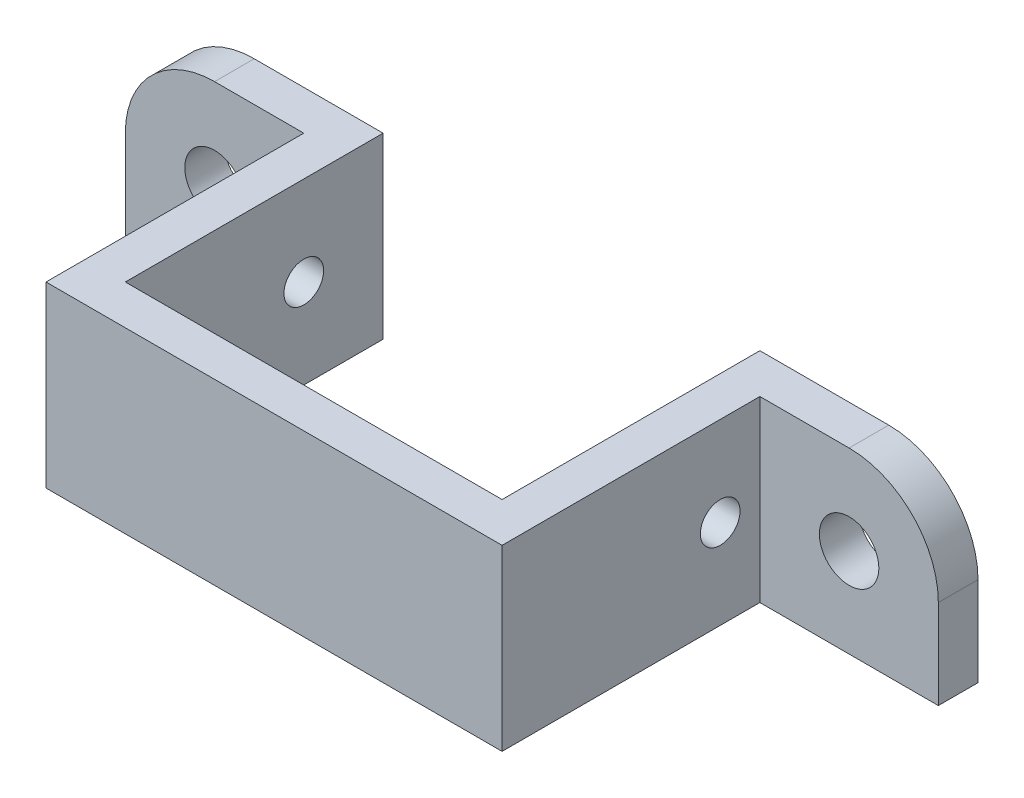
ISO-10303-21;
HEADER;
FILE_DESCRIPTION(('STEP AP214'),'2;1');
FILE_NAME('part.step','',(''),(''),'','','');
FILE_SCHEMA(('AUTOMOTIVE_DESIGN { 1 0 10303 214 1 1 1 1 }'));
ENDSEC;
DATA;
#1=APPLICATION_CONTEXT('core data for automotive mechanical design processes');
#2=APPLICATION_PROTOCOL_DEFINITION('international standard','automotive_design',2000,#1);
#3=PRODUCT_CONTEXT('',#1,'mechanical');
#4=PRODUCT('Part','Part','',(#3));
#5=PRODUCT_RELATED_PRODUCT_CATEGORY('part','',(#4));
#6=PRODUCT_DEFINITION_FORMATION('','',#4);
#7=PRODUCT_DEFINITION_CONTEXT('part definition',#1,'design');
#8=PRODUCT_DEFINITION('design','',#6,#7);
#9=PRODUCT_DEFINITION_SHAPE('','',#8);
#10=(LENGTH_UNIT() NAMED_UNIT(*) SI_UNIT(.MILLI.,.METRE.));
#11=(NAMED_UNIT(*) PLANE_ANGLE_UNIT() SI_UNIT($,.RADIAN.));
#12=(NAMED_UNIT(*) SI_UNIT($,.STERADIAN.) SOLID_ANGLE_UNIT());
#13=UNCERTAINTY_MEASURE_WITH_UNIT(LENGTH_MEASURE(1.E-05),#10,'distance_accuracy_value','');
#14=(GEOMETRIC_REPRESENTATION_CONTEXT(3) GLOBAL_UNCERTAINTY_ASSIGNED_CONTEXT((#13)) GLOBAL_UNIT_ASSIGNED_CONTEXT((#10,
#11,#12)) REPRESENTATION_CONTEXT('',''));
#15=CARTESIAN_POINT('',(0.,0.,0.));
#16=DIRECTION('',(0.,0.,1.));
#17=DIRECTION('',(1.,0.,0.));
#18=AXIS2_PLACEMENT_3D('',#15,#16,#17);
#19=CARTESIAN_POINT('',(-20.5,9.,-11.));
#20=DIRECTION('',(1.,0.,0.));
#21=DIRECTION('',(0.,0.,-1.));
#22=AXIS2_PLACEMENT_3D('',#19,#20,#21);
#23=PLANE('',#22);
#24=DIRECTION('',(0.,0.,1.));
#25=VECTOR('',#24,1.);
#26=CARTESIAN_POINT('',(-20.5,4.5,-13.));
#27=LINE('',#26,#25);
#28=CARTESIAN_POINT('',(-20.5,4.5,-13.));
#29=VERTEX_POINT('',#28);
#30=CARTESIAN_POINT('',(-20.5,4.5,-11.));
#31=VERTEX_POINT('',#30);
#32=EDGE_CURVE('E176',#29,#31,#27,.T.);
#33=ORIENTED_EDGE('',*,*,#32,.F.);
#34=DIRECTION('',(0.,-1.,0.));
#35=VECTOR('',#34,1.);
#36=CARTESIAN_POINT('',(-20.5,9.,-13.));
#37=LINE('',#36,#35);
#38=CARTESIAN_POINT('',(-20.5,0.,-13.));
#39=VERTEX_POINT('',#38);
#40=EDGE_CURVE('E185',#29,#39,#37,.T.);
#41=ORIENTED_EDGE('',*,*,#40,.T.);
#42=DIRECTION('',(0.,0.,1.));
#43=VECTOR('',#42,1.);
#44=CARTESIAN_POINT('',(-20.5,0.,-11.));
#45=LINE('',#44,#43);
#46=CARTESIAN_POINT('',(-20.5,0.,-11.));
#47=VERTEX_POINT('',#46);
#48=EDGE_CURVE('E202',#39,#47,#45,.T.);
#49=ORIENTED_EDGE('',*,*,#48,.T.);
#50=DIRECTION('',(0.,-1.,0.));
#51=VECTOR('',#50,1.);
#52=CARTESIAN_POINT('',(-20.5,9.,-11.));
#53=LINE('',#52,#51);
#54=EDGE_CURVE('E12',#31,#47,#53,.T.);
#55=ORIENTED_EDGE('',*,*,#54,.F.);
#56=EDGE_LOOP('',(#33,#41,#49,#55));
#57=FACE_BOUND('',#56,.T.);
#58=ADVANCED_FACE('F69',(#57),#23,.F.);
#59=CARTESIAN_POINT('',(-11.5,9.,-11.));
#60=DIRECTION('',(0.,0.,-1.));
#61=DIRECTION('',(-1.,0.,0.));
#62=AXIS2_PLACEMENT_3D('',#59,#60,#61);
#63=PLANE('',#62);
#64=CARTESIAN_POINT('',(-16.,4.5,-11.));
#65=DIRECTION('',(0.,0.,1.));
#66=DIRECTION('',(1.,0.,0.));
#67=AXIS2_PLACEMENT_3D('',#64,#65,#66);
#68=CIRCLE('',#67,1.5);
#69=CARTESIAN_POINT('',(-14.5,4.5,-11.));
#70=VERTEX_POINT('',#69);
#71=EDGE_CURVE('E333',#70,#70,#68,.T.);
#72=ORIENTED_EDGE('',*,*,#71,.F.);
#73=EDGE_LOOP('',(#72));
#74=FACE_BOUND('',#73,.T.);
#75=CARTESIAN_POINT('',(-16.,4.5,-11.));
#76=DIRECTION('',(0.,0.,1.));
#77=DIRECTION('',(1.,0.,0.));
#78=AXIS2_PLACEMENT_3D('',#75,#76,#77);
#79=CIRCLE('',#78,4.5);
#80=CARTESIAN_POINT('',(-16.,9.,-11.));
#81=VERTEX_POINT('',#80);
#82=EDGE_CURVE('E93',#81,#31,#79,.T.);
#83=ORIENTED_EDGE('',*,*,#82,.T.);
#84=ORIENTED_EDGE('',*,*,#54,.T.);
#85=DIRECTION('',(1.,0.,0.));
#86=VECTOR('',#85,1.);
#87=CARTESIAN_POINT('',(-11.5,0.,-11.));
#88=LINE('',#87,#86);
#89=CARTESIAN_POINT('',(-11.5,0.,-11.));
#90=VERTEX_POINT('',#89);
#91=EDGE_CURVE('E206',#47,#90,#88,.T.);
#92=ORIENTED_EDGE('',*,*,#91,.T.);
#93=DIRECTION('',(0.,-1.,0.));
#94=VECTOR('',#93,1.);
#95=CARTESIAN_POINT('',(-11.5,9.,-11.));
#96=LINE('',#95,#94);
#97=CARTESIAN_POINT('',(-11.5,9.,-11.));
#98=VERTEX_POINT('',#97);
#99=EDGE_CURVE('E78',#98,#90,#96,.T.);
#100=ORIENTED_EDGE('',*,*,#99,.F.);
#101=DIRECTION('',(1.,0.,0.));
#102=VECTOR('',#101,1.);
#103=CARTESIAN_POINT('',(-11.5,9.,-11.));
#104=LINE('',#103,#102);
#105=EDGE_CURVE('E241',#81,#98,#104,.T.);
#106=ORIENTED_EDGE('',*,*,#105,.F.);
#107=EDGE_LOOP('',(#83,#84,#92,#100,#106));
#108=FACE_BOUND('',#107,.T.);
#109=ADVANCED_FACE('F370',(#74,#108),#63,.F.);
#110=CARTESIAN_POINT('',(20.5,9.,-11.));
#111=DIRECTION('',(0.,0.,-1.));
#112=DIRECTION('',(-1.,0.,0.));
#113=AXIS2_PLACEMENT_3D('',#110,#111,#112);
#114=PLANE('',#113);
#115=CARTESIAN_POINT('',(16.,4.5,-11.));
#116=DIRECTION('',(0.,0.,1.));
#117=DIRECTION('',(1.,0.,0.));
#118=AXIS2_PLACEMENT_3D('',#115,#116,#117);
#119=CIRCLE('',#118,1.5);
#120=CARTESIAN_POINT('',(17.5,4.5,-11.));
#121=VERTEX_POINT('',#120);
#122=EDGE_CURVE('E375',#121,#121,#119,.F.);
#123=ORIENTED_EDGE('',*,*,#122,.T.);
#124=EDGE_LOOP('',(#123));
#125=FACE_BOUND('',#124,.T.);
#126=DIRECTION('',(0.,-1.,0.));
#127=VECTOR('',#126,1.);
#128=CARTESIAN_POINT('',(20.5,9.,-11.));
#129=LINE('',#128,#127);
#130=CARTESIAN_POINT('',(20.5,4.5,-11.));
#131=VERTEX_POINT('',#130);
#132=CARTESIAN_POINT('',(20.5,0.,-11.));
#133=VERTEX_POINT('',#132);
#134=EDGE_CURVE('E260',#131,#133,#129,.T.);
#135=ORIENTED_EDGE('',*,*,#134,.F.);
#136=CARTESIAN_POINT('',(16.,4.5,-11.));
#137=DIRECTION('',(0.,0.,1.));
#138=DIRECTION('',(1.,0.,0.));
#139=AXIS2_PLACEMENT_3D('',#136,#137,#138);
#140=CIRCLE('',#139,4.5);
#141=CARTESIAN_POINT('',(16.,9.00000000000001,-11.));
#142=VERTEX_POINT('',#141);
#143=EDGE_CURVE('E344',#142,#131,#140,.F.);
#144=ORIENTED_EDGE('',*,*,#143,.F.);
#145=DIRECTION('',(1.,0.,0.));
#146=VECTOR('',#145,1.);
#147=CARTESIAN_POINT('',(20.5,9.,-11.));
#148=LINE('',#147,#146);
#149=CARTESIAN_POINT('',(11.5,9.,-11.));
#150=VERTEX_POINT('',#149);
#151=EDGE_CURVE('E304',#150,#142,#148,.T.);
#152=ORIENTED_EDGE('',*,*,#151,.F.);
#153=DIRECTION('',(0.,-1.,0.));
#154=VECTOR('',#153,1.);
#155=CARTESIAN_POINT('',(11.5,9.,-11.));
#156=LINE('',#155,#154);
#157=CARTESIAN_POINT('',(11.5,0.,-11.));
#158=VERTEX_POINT('',#157);
#159=EDGE_CURVE('E263',#150,#158,#156,.T.);
#160=ORIENTED_EDGE('',*,*,#159,.T.);
#161=DIRECTION('',(1.,0.,0.));
#162=VECTOR('',#161,1.);
#163=CARTESIAN_POINT('',(20.5,0.,-11.));
#164=LINE('',#163,#162);
#165=EDGE_CURVE('E219',#158,#133,#164,.T.);
#166=ORIENTED_EDGE('',*,*,#165,.T.);
#167=EDGE_LOOP('',(#135,#144,#152,#160,#166));
#168=FACE_BOUND('',#167,.T.);
#169=ADVANCED_FACE('F381',(#125,#168),#114,.F.);
#170=CARTESIAN_POINT('',(20.5,9.,-13.));
#171=DIRECTION('',(-1.,0.,0.));
#172=DIRECTION('',(0.,0.,1.));
#173=AXIS2_PLACEMENT_3D('',#170,#171,#172);
#174=PLANE('',#173);
#175=DIRECTION('',(0.,0.,1.));
#176=VECTOR('',#175,1.);
#177=CARTESIAN_POINT('',(20.5,4.5,-13.));
#178=LINE('',#177,#176);
#179=CARTESIAN_POINT('',(20.5,4.5,-13.));
#180=VERTEX_POINT('',#179);
#181=EDGE_CURVE('E348',#180,#131,#178,.T.);
#182=ORIENTED_EDGE('',*,*,#181,.T.);
#183=ORIENTED_EDGE('',*,*,#134,.T.);
#184=DIRECTION('',(0.,0.,-1.));
#185=VECTOR('',#184,1.);
#186=CARTESIAN_POINT('',(20.5,0.,-13.));
#187=LINE('',#186,#185);
#188=CARTESIAN_POINT('',(20.5,0.,-13.));
#189=VERTEX_POINT('',#188);
#190=EDGE_CURVE('E223',#133,#189,#187,.T.);
#191=ORIENTED_EDGE('',*,*,#190,.T.);
#192=DIRECTION('',(0.,-1.,0.));
#193=VECTOR('',#192,1.);
#194=CARTESIAN_POINT('',(20.5,9.,-13.));
#195=LINE('',#194,#193);
#196=EDGE_CURVE('E257',#180,#189,#195,.T.);
#197=ORIENTED_EDGE('',*,*,#196,.F.);
#198=EDGE_LOOP('',(#182,#183,#191,#197));
#199=FACE_BOUND('',#198,.T.);
#200=ADVANCED_FACE('F403',(#199),#174,.F.);
#201=CARTESIAN_POINT('',(9.5,9.,-13.));
#202=DIRECTION('',(0.,0.,1.));
#203=DIRECTION('',(1.,0.,0.));
#204=AXIS2_PLACEMENT_3D('',#201,#202,#203);
#205=PLANE('',#204);
#206=CARTESIAN_POINT('',(16.,4.5,-13.));
#207=DIRECTION('',(0.,0.,1.));
#208=DIRECTION('',(1.,0.,0.));
#209=AXIS2_PLACEMENT_3D('',#206,#207,#208);
#210=CIRCLE('',#209,1.5);
#211=CARTESIAN_POINT('',(17.5,4.5,-13.));
#212=VERTEX_POINT('',#211);
#213=EDGE_CURVE('E347',#212,#212,#210,.F.);
#214=ORIENTED_EDGE('',*,*,#213,.F.);
#215=EDGE_LOOP('',(#214));
#216=FACE_BOUND('',#215,.T.);
#217=DIRECTION('',(-1.,0.,0.));
#218=VECTOR('',#217,1.);
#219=CARTESIAN_POINT('',(9.5,9.,-13.));
#220=LINE('',#219,#218);
#221=CARTESIAN_POINT('',(16.,9.,-13.));
#222=VERTEX_POINT('',#221);
#223=CARTESIAN_POINT('',(9.5,9.,-13.));
#224=VERTEX_POINT('',#223);
#225=EDGE_CURVE('E309',#222,#224,#220,.T.);
#226=ORIENTED_EDGE('',*,*,#225,.F.);
#227=CARTESIAN_POINT('',(16.,4.5,-13.));
#228=DIRECTION('',(0.,0.,1.));
#229=DIRECTION('',(1.,0.,0.));
#230=AXIS2_PLACEMENT_3D('',#227,#228,#229);
#231=CIRCLE('',#230,4.5);
#232=EDGE_CURVE('E85',#222,#180,#231,.F.);
#233=ORIENTED_EDGE('',*,*,#232,.T.);
#234=ORIENTED_EDGE('',*,*,#196,.T.);
#235=DIRECTION('',(-1.,0.,0.));
#236=VECTOR('',#235,1.);
#237=CARTESIAN_POINT('',(9.5,0.,-13.));
#238=LINE('',#237,#236);
#239=CARTESIAN_POINT('',(9.5,0.,-13.));
#240=VERTEX_POINT('',#239);
#241=EDGE_CURVE('E227',#189,#240,#238,.T.);
#242=ORIENTED_EDGE('',*,*,#241,.T.);
#243=DIRECTION('',(0.,-1.,0.));
#244=VECTOR('',#243,1.);
#245=CARTESIAN_POINT('',(9.5,9.,-13.));
#246=LINE('',#245,#244);
#247=EDGE_CURVE('E253',#224,#240,#246,.T.);
#248=ORIENTED_EDGE('',*,*,#247,.F.);
#249=EDGE_LOOP('',(#226,#233,#234,#242,#248));
#250=FACE_BOUND('',#249,.T.);
#251=ADVANCED_FACE('F418',(#216,#250),#205,.F.);
#252=CARTESIAN_POINT('',(-20.5,9.,-13.));
#253=DIRECTION('',(0.,0.,1.));
#254=DIRECTION('',(1.,0.,0.));
#255=AXIS2_PLACEMENT_3D('',#252,#253,#254);
#256=PLANE('',#255);
#257=CARTESIAN_POINT('',(-16.,4.5,-13.));
#258=DIRECTION('',(0.,0.,1.));
#259=DIRECTION('',(1.,0.,0.));
#260=AXIS2_PLACEMENT_3D('',#257,#258,#259);
#261=CIRCLE('',#260,1.5);
#262=CARTESIAN_POINT('',(-14.5,4.5,-13.));
#263=VERTEX_POINT('',#262);
#264=EDGE_CURVE('E337',#263,#263,#261,.T.);
#265=ORIENTED_EDGE('',*,*,#264,.T.);
#266=EDGE_LOOP('',(#265));
#267=FACE_BOUND('',#266,.T.);
#268=CARTESIAN_POINT('',(-16.,4.5,-13.));
#269=DIRECTION('',(0.,0.,1.));
#270=DIRECTION('',(1.,0.,0.));
#271=AXIS2_PLACEMENT_3D('',#268,#269,#270);
#272=CIRCLE('',#271,4.5);
#273=CARTESIAN_POINT('',(-16.,9.,-13.));
#274=VERTEX_POINT('',#273);
#275=EDGE_CURVE('E170',#274,#29,#272,.T.);
#276=ORIENTED_EDGE('',*,*,#275,.F.);
#277=DIRECTION('',(-1.,0.,0.));
#278=VECTOR('',#277,1.);
#279=CARTESIAN_POINT('',(-20.5,9.,-13.));
#280=LINE('',#279,#278);
#281=CARTESIAN_POINT('',(-9.5,9.,-13.));
#282=VERTEX_POINT('',#281);
#283=EDGE_CURVE('E183',#282,#274,#280,.T.);
#284=ORIENTED_EDGE('',*,*,#283,.F.);
#285=DIRECTION('',(0.,-1.,0.));
#286=VECTOR('',#285,1.);
#287=CARTESIAN_POINT('',(-9.5,9.,-13.));
#288=LINE('',#287,#286);
#289=CARTESIAN_POINT('',(-9.5,0.,-13.));
#290=VERTEX_POINT('',#289);
#291=EDGE_CURVE('E196',#282,#290,#288,.T.);
#292=ORIENTED_EDGE('',*,*,#291,.T.);
#293=DIRECTION('',(-1.,0.,0.));
#294=VECTOR('',#293,1.);
#295=CARTESIAN_POINT('',(-20.5,0.,-13.));
#296=LINE('',#295,#294);
#297=EDGE_CURVE('E239',#290,#39,#296,.T.);
#298=ORIENTED_EDGE('',*,*,#297,.T.);
#299=ORIENTED_EDGE('',*,*,#40,.F.);
#300=EDGE_LOOP('',(#276,#284,#292,#298,#299));
#301=FACE_BOUND('',#300,.T.);
#302=ADVANCED_FACE('F181',(#267,#301),#256,.F.);
#303=CARTESIAN_POINT('',(-11.5,9.,2.));
#304=DIRECTION('',(1.,0.,0.));
#305=DIRECTION('',(0.,0.,-1.));
#306=AXIS2_PLACEMENT_3D('',#303,#304,#305);
#307=PLANE('',#306);
#308=CARTESIAN_POINT('',(-11.5,4.5,-9.));
#309=DIRECTION('',(-1.,0.,0.));
#310=DIRECTION('',(0.,0.,1.));
#311=AXIS2_PLACEMENT_3D('',#308,#309,#310);
#312=CIRCLE('',#311,1.);
#313=CARTESIAN_POINT('',(-11.5,4.5,-8.));
#314=VERTEX_POINT('',#313);
#315=EDGE_CURVE('E356',#314,#314,#312,.T.);
#316=ORIENTED_EDGE('',*,*,#315,.F.);
#317=EDGE_LOOP('',(#316));
#318=FACE_BOUND('',#317,.T.);
#319=DIRECTION('',(0.,0.,1.));
#320=VECTOR('',#319,1.);
#321=CARTESIAN_POINT('',(-11.5,0.,2.));
#322=LINE('',#321,#320);
#323=CARTESIAN_POINT('',(-11.5,0.,2.));
#324=VERTEX_POINT('',#323);
#325=EDGE_CURVE('E210',#90,#324,#322,.T.);
#326=ORIENTED_EDGE('',*,*,#325,.T.);
#327=DIRECTION('',(0.,-1.,0.));
#328=VECTOR('',#327,1.);
#329=CARTESIAN_POINT('',(-11.5,9.,2.));
#330=LINE('',#329,#328);
#331=CARTESIAN_POINT('',(-11.5,9.,2.));
#332=VERTEX_POINT('',#331);
#333=EDGE_CURVE('E271',#332,#324,#330,.T.);
#334=ORIENTED_EDGE('',*,*,#333,.F.);
#335=DIRECTION('',(0.,0.,1.));
#336=VECTOR('',#335,1.);
#337=CARTESIAN_POINT('',(-11.5,9.,2.));
#338=LINE('',#337,#336);
#339=EDGE_CURVE('E283',#98,#332,#338,.T.);
#340=ORIENTED_EDGE('',*,*,#339,.F.);
#341=ORIENTED_EDGE('',*,*,#99,.T.);
#342=EDGE_LOOP('',(#326,#334,#340,#341));
#343=FACE_BOUND('',#342,.T.);
#344=ADVANCED_FACE('F281',(#318,#343),#307,.F.);
#345=CARTESIAN_POINT('',(11.5,9.,2.));
#346=DIRECTION('',(0.,0.,-1.));
#347=DIRECTION('',(-1.,0.,0.));
#348=AXIS2_PLACEMENT_3D('',#345,#346,#347);
#349=PLANE('',#348);
#350=DIRECTION('',(1.,0.,0.));
#351=VECTOR('',#350,1.);
#352=CARTESIAN_POINT('',(11.5,0.,2.));
#353=LINE('',#352,#351);
#354=CARTESIAN_POINT('',(11.5,0.,2.));
#355=VERTEX_POINT('',#354);
#356=EDGE_CURVE('E213',#324,#355,#353,.T.);
#357=ORIENTED_EDGE('',*,*,#356,.T.);
#358=DIRECTION('',(0.,-1.,0.));
#359=VECTOR('',#358,1.);
#360=CARTESIAN_POINT('',(11.5,9.,2.));
#361=LINE('',#360,#359);
#362=CARTESIAN_POINT('',(11.5,9.,2.));
#363=VERTEX_POINT('',#362);
#364=EDGE_CURVE('E267',#363,#355,#361,.T.);
#365=ORIENTED_EDGE('',*,*,#364,.F.);
#366=DIRECTION('',(1.,0.,0.));
#367=VECTOR('',#366,1.);
#368=CARTESIAN_POINT('',(11.5,9.,2.));
#369=LINE('',#368,#367);
#370=EDGE_CURVE('E305',#332,#363,#369,.T.);
#371=ORIENTED_EDGE('',*,*,#370,.F.);
#372=ORIENTED_EDGE('',*,*,#333,.T.);
#373=EDGE_LOOP('',(#357,#365,#371,#372));
#374=FACE_BOUND('',#373,.T.);
#375=ADVANCED_FACE('F294',(#374),#349,.F.);
#376=CARTESIAN_POINT('',(11.5,9.,-11.));
#377=DIRECTION('',(-1.,0.,0.));
#378=DIRECTION('',(0.,0.,1.));
#379=AXIS2_PLACEMENT_3D('',#376,#377,#378);
#380=PLANE('',#379);
#381=CARTESIAN_POINT('',(11.5,4.5,-9.));
#382=DIRECTION('',(-1.,0.,0.));
#383=DIRECTION('',(0.,0.,1.));
#384=AXIS2_PLACEMENT_3D('',#381,#382,#383);
#385=CIRCLE('',#384,1.);
#386=CARTESIAN_POINT('',(11.5,4.5,-8.));
#387=VERTEX_POINT('',#386);
#388=EDGE_CURVE('E207',#387,#387,#385,.T.);
#389=ORIENTED_EDGE('',*,*,#388,.T.);
#390=EDGE_LOOP('',(#389));
#391=FACE_BOUND('',#390,.T.);
#392=DIRECTION('',(0.,0.,-1.));
#393=VECTOR('',#392,1.);
#394=CARTESIAN_POINT('',(11.5,0.,-11.));
#395=LINE('',#394,#393);
#396=EDGE_CURVE('E216',#355,#158,#395,.T.);
#397=ORIENTED_EDGE('',*,*,#396,.T.);
#398=ORIENTED_EDGE('',*,*,#159,.F.);
#399=DIRECTION('',(0.,0.,-1.));
#400=VECTOR('',#399,1.);
#401=CARTESIAN_POINT('',(11.5,9.,-11.));
#402=LINE('',#401,#400);
#403=EDGE_CURVE('E300',#363,#150,#402,.T.);
#404=ORIENTED_EDGE('',*,*,#403,.F.);
#405=ORIENTED_EDGE('',*,*,#364,.T.);
#406=EDGE_LOOP('',(#397,#398,#404,#405));
#407=FACE_BOUND('',#406,.T.);
#408=ADVANCED_FACE('F298',(#391,#407),#380,.F.);
#409=CARTESIAN_POINT('',(9.5,9.,0.));
#410=DIRECTION('',(1.,0.,0.));
#411=DIRECTION('',(0.,0.,-1.));
#412=AXIS2_PLACEMENT_3D('',#409,#410,#411);
#413=PLANE('',#412);
#414=CARTESIAN_POINT('',(9.5,4.5,-9.));
#415=DIRECTION('',(1.,0.,0.));
#416=DIRECTION('',(0.,0.,-1.));
#417=AXIS2_PLACEMENT_3D('',#414,#415,#416);
#418=CIRCLE('',#417,1.);
#419=CARTESIAN_POINT('',(9.5,4.5,-10.));
#420=VERTEX_POINT('',#419);
#421=EDGE_CURVE('E361',#420,#420,#418,.T.);
#422=ORIENTED_EDGE('',*,*,#421,.T.);
#423=EDGE_LOOP('',(#422));
#424=FACE_BOUND('',#423,.T.);
#425=DIRECTION('',(0.,0.,1.));
#426=VECTOR('',#425,1.);
#427=CARTESIAN_POINT('',(9.5,0.,0.));
#428=LINE('',#427,#426);
#429=CARTESIAN_POINT('',(9.5,0.,0.));
#430=VERTEX_POINT('',#429);
#431=EDGE_CURVE('E230',#240,#430,#428,.T.);
#432=ORIENTED_EDGE('',*,*,#431,.T.);
#433=DIRECTION('',(0.,-1.,0.));
#434=VECTOR('',#433,1.);
#435=CARTESIAN_POINT('',(9.5,9.,0.));
#436=LINE('',#435,#434);
#437=CARTESIAN_POINT('',(9.5,9.,0.));
#438=VERTEX_POINT('',#437);
#439=EDGE_CURVE('E249',#438,#430,#436,.T.);
#440=ORIENTED_EDGE('',*,*,#439,.F.);
#441=DIRECTION('',(0.,0.,1.));
#442=VECTOR('',#441,1.);
#443=CARTESIAN_POINT('',(9.5,9.,0.));
#444=LINE('',#443,#442);
#445=EDGE_CURVE('E316',#224,#438,#444,.T.);
#446=ORIENTED_EDGE('',*,*,#445,.F.);
#447=ORIENTED_EDGE('',*,*,#247,.T.);
#448=EDGE_LOOP('',(#432,#440,#446,#447));
#449=FACE_BOUND('',#448,.T.);
#450=ADVANCED_FACE('F413',(#424,#449),#413,.F.);
#451=CARTESIAN_POINT('',(-9.5,9.,0.));
#452=DIRECTION('',(0.,0.,1.));
#453=DIRECTION('',(1.,0.,0.));
#454=AXIS2_PLACEMENT_3D('',#451,#452,#453);
#455=PLANE('',#454);
#456=DIRECTION('',(-1.,0.,0.));
#457=VECTOR('',#456,1.);
#458=CARTESIAN_POINT('',(-9.5,0.,0.));
#459=LINE('',#458,#457);
#460=CARTESIAN_POINT('',(-9.5,0.,0.));
#461=VERTEX_POINT('',#460);
#462=EDGE_CURVE('E233',#430,#461,#459,.T.);
#463=ORIENTED_EDGE('',*,*,#462,.T.);
#464=DIRECTION('',(0.,-1.,0.));
#465=VECTOR('',#464,1.);
#466=CARTESIAN_POINT('',(-9.5,9.,0.));
#467=LINE('',#466,#465);
#468=CARTESIAN_POINT('',(-9.5,9.,0.));
#469=VERTEX_POINT('',#468);
#470=EDGE_CURVE('E245',#469,#461,#467,.T.);
#471=ORIENTED_EDGE('',*,*,#470,.F.);
#472=DIRECTION('',(-1.,0.,0.));
#473=VECTOR('',#472,1.);
#474=CARTESIAN_POINT('',(-9.5,9.,0.));
#475=LINE('',#474,#473);
#476=EDGE_CURVE('E198',#438,#469,#475,.T.);
#477=ORIENTED_EDGE('',*,*,#476,.F.);
#478=ORIENTED_EDGE('',*,*,#439,.T.);
#479=EDGE_LOOP('',(#463,#471,#477,#478));
#480=FACE_BOUND('',#479,.T.);
#481=ADVANCED_FACE('F324',(#480),#455,.F.);
#482=CARTESIAN_POINT('',(-9.5,9.,-13.));
#483=DIRECTION('',(-1.,0.,0.));
#484=DIRECTION('',(0.,0.,1.));
#485=AXIS2_PLACEMENT_3D('',#482,#483,#484);
#486=PLANE('',#485);
#487=CARTESIAN_POINT('',(-9.5,4.5,-9.));
#488=DIRECTION('',(-1.,0.,0.));
#489=DIRECTION('',(0.,0.,1.));
#490=AXIS2_PLACEMENT_3D('',#487,#488,#489);
#491=CIRCLE('',#490,1.);
#492=CARTESIAN_POINT('',(-9.5,4.5,-8.));
#493=VERTEX_POINT('',#492);
#494=EDGE_CURVE('E72',#493,#493,#491,.T.);
#495=ORIENTED_EDGE('',*,*,#494,.T.);
#496=EDGE_LOOP('',(#495));
#497=FACE_BOUND('',#496,.T.);
#498=DIRECTION('',(0.,0.,-1.));
#499=VECTOR('',#498,1.);
#500=CARTESIAN_POINT('',(-9.5,0.,-13.));
#501=LINE('',#500,#499);
#502=EDGE_CURVE('E236',#461,#290,#501,.T.);
#503=ORIENTED_EDGE('',*,*,#502,.T.);
#504=ORIENTED_EDGE('',*,*,#291,.F.);
#505=DIRECTION('',(0.,0.,-1.));
#506=VECTOR('',#505,1.);
#507=CARTESIAN_POINT('',(-9.5,9.,-13.));
#508=LINE('',#507,#506);
#509=EDGE_CURVE('E190',#469,#282,#508,.T.);
#510=ORIENTED_EDGE('',*,*,#509,.F.);
#511=ORIENTED_EDGE('',*,*,#470,.T.);
#512=EDGE_LOOP('',(#503,#504,#510,#511));
#513=FACE_BOUND('',#512,.T.);
#514=ADVANCED_FACE('F328',(#497,#513),#486,.F.);
#515=CARTESIAN_POINT('',(0.,9.,0.));
#516=DIRECTION('',(0.,-1.,0.));
#517=DIRECTION('',(0.,0.,-1.));
#518=AXIS2_PLACEMENT_3D('',#515,#516,#517);
#519=PLANE('',#518);
#520=ORIENTED_EDGE('',*,*,#283,.T.);
#521=DIRECTION('',(0.,0.,1.));
#522=VECTOR('',#521,1.);
#523=CARTESIAN_POINT('',(-16.,9.,-13.));
#524=LINE('',#523,#522);
#525=EDGE_CURVE('E167',#274,#81,#524,.T.);
#526=ORIENTED_EDGE('',*,*,#525,.T.);
#527=ORIENTED_EDGE('',*,*,#105,.T.);
#528=ORIENTED_EDGE('',*,*,#339,.T.);
#529=ORIENTED_EDGE('',*,*,#370,.T.);
#530=ORIENTED_EDGE('',*,*,#403,.T.);
#531=ORIENTED_EDGE('',*,*,#151,.T.);
#532=DIRECTION('',(0.,0.,1.));
#533=VECTOR('',#532,1.);
#534=CARTESIAN_POINT('',(16.,9.00000000000001,-13.));
#535=LINE('',#534,#533);
#536=EDGE_CURVE('E343',#222,#142,#535,.T.);
#537=ORIENTED_EDGE('',*,*,#536,.F.);
#538=ORIENTED_EDGE('',*,*,#225,.T.);
#539=ORIENTED_EDGE('',*,*,#445,.T.);
#540=ORIENTED_EDGE('',*,*,#476,.T.);
#541=ORIENTED_EDGE('',*,*,#509,.T.);
#542=EDGE_LOOP('',(#520,#526,#527,#528,#529,#530,#531,#537,#538,#539,#540,#541));
#543=FACE_BOUND('',#542,.T.);
#544=ADVANCED_FACE('F188',(#543),#519,.F.);
#545=CARTESIAN_POINT('',(0.,0.,0.));
#546=DIRECTION('',(0.,-1.,0.));
#547=DIRECTION('',(0.,0.,-1.));
#548=AXIS2_PLACEMENT_3D('',#545,#546,#547);
#549=PLANE('',#548);
#550=ORIENTED_EDGE('',*,*,#48,.F.);
#551=ORIENTED_EDGE('',*,*,#297,.F.);
#552=ORIENTED_EDGE('',*,*,#502,.F.);
#553=ORIENTED_EDGE('',*,*,#462,.F.);
#554=ORIENTED_EDGE('',*,*,#431,.F.);
#555=ORIENTED_EDGE('',*,*,#241,.F.);
#556=ORIENTED_EDGE('',*,*,#190,.F.);
#557=ORIENTED_EDGE('',*,*,#165,.F.);
#558=ORIENTED_EDGE('',*,*,#396,.F.);
#559=ORIENTED_EDGE('',*,*,#356,.F.);
#560=ORIENTED_EDGE('',*,*,#325,.F.);
#561=ORIENTED_EDGE('',*,*,#91,.F.);
#562=EDGE_LOOP('',(#550,#551,#552,#553,#554,#555,#556,#557,#558,#559,#560,#561));
#563=FACE_BOUND('',#562,.T.);
#564=ADVANCED_FACE('F289',(#563),#549,.T.);
#565=CARTESIAN_POINT('',(20.5,4.5,-9.));
#566=DIRECTION('',(-1.,0.,0.));
#567=DIRECTION('',(0.,0.,1.));
#568=AXIS2_PLACEMENT_3D('',#565,#566,#567);
#569=CYLINDRICAL_SURFACE('',#568,1.);
#570=ORIENTED_EDGE('',*,*,#315,.T.);
#571=EDGE_LOOP('',(#570));
#572=FACE_BOUND('',#571,.T.);
#573=ORIENTED_EDGE('',*,*,#494,.F.);
#574=EDGE_LOOP('',(#573));
#575=FACE_BOUND('',#574,.T.);
#576=ADVANCED_FACE('F436',(#572,#575),#569,.F.);
#577=ORIENTED_EDGE('',*,*,#421,.F.);
#578=EDGE_LOOP('',(#577));
#579=FACE_BOUND('',#578,.T.);
#580=ORIENTED_EDGE('',*,*,#388,.F.);
#581=EDGE_LOOP('',(#580));
#582=FACE_BOUND('',#581,.T.);
#583=ADVANCED_FACE('F439',(#579,#582),#569,.F.);
#584=CARTESIAN_POINT('',(16.,4.5,-13.));
#585=DIRECTION('',(0.,0.,1.));
#586=DIRECTION('',(1.,0.,0.));
#587=AXIS2_PLACEMENT_3D('',#584,#585,#586);
#588=CYLINDRICAL_SURFACE('',#587,4.5);
#589=ORIENTED_EDGE('',*,*,#143,.T.);
#590=ORIENTED_EDGE('',*,*,#181,.F.);
#591=ORIENTED_EDGE('',*,*,#232,.F.);
#592=ORIENTED_EDGE('',*,*,#536,.T.);
#593=EDGE_LOOP('',(#589,#590,#591,#592));
#594=FACE_BOUND('',#593,.T.);
#595=ADVANCED_FACE('F441',(#594),#588,.T.);
#596=CARTESIAN_POINT('',(-16.,4.5,-13.));
#597=DIRECTION('',(0.,0.,1.));
#598=DIRECTION('',(1.,0.,0.));
#599=AXIS2_PLACEMENT_3D('',#596,#597,#598);
#600=CYLINDRICAL_SURFACE('',#599,4.5);
#601=ORIENTED_EDGE('',*,*,#82,.F.);
#602=ORIENTED_EDGE('',*,*,#525,.F.);
#603=ORIENTED_EDGE('',*,*,#275,.T.);
#604=ORIENTED_EDGE('',*,*,#32,.T.);
#605=EDGE_LOOP('',(#601,#602,#603,#604));
#606=FACE_BOUND('',#605,.T.);
#607=ADVANCED_FACE('F169',(#606),#600,.T.);
#608=CARTESIAN_POINT('',(-16.,4.5,-13.));
#609=DIRECTION('',(0.,0.,1.));
#610=DIRECTION('',(1.,0.,0.));
#611=AXIS2_PLACEMENT_3D('',#608,#609,#610);
#612=CYLINDRICAL_SURFACE('',#611,1.5);
#613=ORIENTED_EDGE('',*,*,#264,.F.);
#614=EDGE_LOOP('',(#613));
#615=FACE_BOUND('',#614,.T.);
#616=ORIENTED_EDGE('',*,*,#71,.T.);
#617=EDGE_LOOP('',(#616));
#618=FACE_BOUND('',#617,.T.);
#619=ADVANCED_FACE('F386',(#615,#618),#612,.F.);
#620=CARTESIAN_POINT('',(16.,4.5,-13.));
#621=DIRECTION('',(0.,0.,1.));
#622=DIRECTION('',(1.,0.,0.));
#623=AXIS2_PLACEMENT_3D('',#620,#621,#622);
#624=CYLINDRICAL_SURFACE('',#623,1.5);
#625=ORIENTED_EDGE('',*,*,#213,.T.);
#626=EDGE_LOOP('',(#625));
#627=FACE_BOUND('',#626,.T.);
#628=ORIENTED_EDGE('',*,*,#122,.F.);
#629=EDGE_LOOP('',(#628));
#630=FACE_BOUND('',#629,.T.);
#631=ADVANCED_FACE('F384',(#627,#630),#624,.F.);
#632=CLOSED_SHELL('',(#58,#109,#169,#200,#251,#302,#344,#375,#408,#450,#481,#514,#544,#564,#576,
#583,#595,#607,#619,#631));
#633=MANIFOLD_SOLID_BREP('B2',#632);
#634=ADVANCED_BREP_SHAPE_REPRESENTATION('',(#18,#633),#14);
#635=SHAPE_DEFINITION_REPRESENTATION(#9,#634);
ENDSEC;
END-ISO-10303-21;
